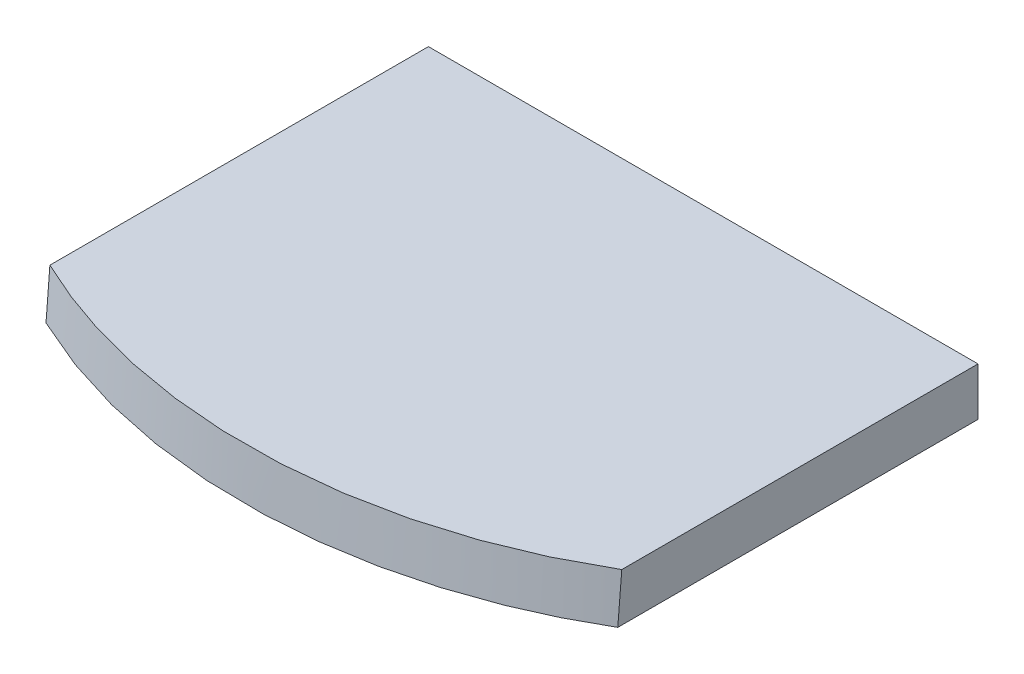
ISO-10303-21;
HEADER;
FILE_DESCRIPTION(('STEP AP214'),'2;1');
FILE_NAME('part.step','',(''),(''),'','','');
FILE_SCHEMA(('AUTOMOTIVE_DESIGN { 1 0 10303 214 1 1 1 1 }'));
ENDSEC;
DATA;
#1=APPLICATION_CONTEXT('core data for automotive mechanical design processes');
#2=APPLICATION_PROTOCOL_DEFINITION('international standard','automotive_design',2000,#1);
#3=PRODUCT_CONTEXT('',#1,'mechanical');
#4=PRODUCT('Part','Part','',(#3));
#5=PRODUCT_RELATED_PRODUCT_CATEGORY('part','',(#4));
#6=PRODUCT_DEFINITION_FORMATION('','',#4);
#7=PRODUCT_DEFINITION_CONTEXT('part definition',#1,'design');
#8=PRODUCT_DEFINITION('design','',#6,#7);
#9=PRODUCT_DEFINITION_SHAPE('','',#8);
#10=(LENGTH_UNIT() NAMED_UNIT(*) SI_UNIT(.MILLI.,.METRE.));
#11=(NAMED_UNIT(*) PLANE_ANGLE_UNIT() SI_UNIT($,.RADIAN.));
#12=(NAMED_UNIT(*) SI_UNIT($,.STERADIAN.) SOLID_ANGLE_UNIT());
#13=UNCERTAINTY_MEASURE_WITH_UNIT(LENGTH_MEASURE(1.E-05),#10,'distance_accuracy_value','');
#14=(GEOMETRIC_REPRESENTATION_CONTEXT(3) GLOBAL_UNCERTAINTY_ASSIGNED_CONTEXT((#13)) GLOBAL_UNIT_ASSIGNED_CONTEXT((#10,
#11,#12)) REPRESENTATION_CONTEXT('',''));
#15=CARTESIAN_POINT('',(0.,0.,0.));
#16=DIRECTION('',(0.,0.,1.));
#17=DIRECTION('',(1.,0.,0.));
#18=AXIS2_PLACEMENT_3D('',#15,#16,#17);
#19=CARTESIAN_POINT('',(21.5,-176.5,20.8978327647945));
#20=DIRECTION('',(-1.,0.,0.));
#21=DIRECTION('',(0.,-1.,0.));
#22=AXIS2_PLACEMENT_3D('',#19,#20,#21);
#23=PLANE('',#22);
#24=CARTESIAN_POINT('',(21.5,-186.5,25.9269520773484));
#25=CARTESIAN_POINT('',(21.5,-187.083331798923,25.975530300075));
#26=CARTESIAN_POINT('',(21.5,-187.666664365051,26.0240993066086));
#27=CARTESIAN_POINT('',(21.5000000000001,-188.833331031718,26.1212188872896));
#28=CARTESIAN_POINT('',(21.5000000000001,-189.416665132256,26.169769461437));
#29=CARTESIAN_POINT('',(21.5000000000001,-190.,26.2183108193915));
#30=B_SPLINE_CURVE_WITH_KNOTS('',3,(#24,#25,#26,#27,#28,#29),.UNSPECIFIED.,.F.,.F.,(4,2,4),(0.,
1.75605309712185,3.51210619424374),.UNSPECIFIED.);
#31=CARTESIAN_POINT('',(21.5,-186.5,25.9269520773484));
#32=VERTEX_POINT('',#31);
#33=CARTESIAN_POINT('',(21.499999810714,-190.,26.2183113624354));
#34=VERTEX_POINT('',#33);
#35=EDGE_CURVE('E170',#32,#34,#30,.T.);
#36=ORIENTED_EDGE('',*,*,#35,.T.);
#37=DIRECTION('',(0.,0.,1.));
#38=VECTOR('',#37,1.);
#39=CARTESIAN_POINT('',(21.5000000000001,-190.,0.));
#40=LINE('',#39,#38);
#41=CARTESIAN_POINT('',(21.5,-190.,0.));
#42=VERTEX_POINT('',#41);
#43=EDGE_CURVE('E70',#42,#34,#40,.T.);
#44=ORIENTED_EDGE('',*,*,#43,.F.);
#45=DIRECTION('',(0.,-1.,0.));
#46=VECTOR('',#45,1.);
#47=CARTESIAN_POINT('',(21.4999999999996,0.,0.));
#48=LINE('',#47,#46);
#49=CARTESIAN_POINT('',(21.5000000005769,-186.5,0.));
#50=VERTEX_POINT('',#49);
#51=EDGE_CURVE('E48',#50,#42,#48,.T.);
#52=ORIENTED_EDGE('',*,*,#51,.F.);
#53=DIRECTION('',(0.,0.,-1.));
#54=VECTOR('',#53,1.);
#55=CARTESIAN_POINT('',(21.5,-186.5,20.8978327647945));
#56=LINE('',#55,#54);
#57=EDGE_CURVE('E11',#32,#50,#56,.T.);
#58=ORIENTED_EDGE('',*,*,#57,.F.);
#59=EDGE_LOOP('',(#36,#44,#52,#58));
#60=FACE_BOUND('',#59,.T.);
#61=ADVANCED_FACE('F43',(#60),#23,.F.);
#62=CARTESIAN_POINT('',(0.,0.,0.));
#63=DIRECTION('',(0.,0.,1.));
#64=DIRECTION('',(1.,0.,0.));
#65=AXIS2_PLACEMENT_3D('',#62,#63,#64);
#66=PLANE('',#65);
#67=DIRECTION('',(0.,-1.,0.));
#68=VECTOR('',#67,1.);
#69=CARTESIAN_POINT('',(-18.5,0.,0.));
#70=LINE('',#69,#68);
#71=CARTESIAN_POINT('',(-18.5,-186.5,0.));
#72=VERTEX_POINT('',#71);
#73=CARTESIAN_POINT('',(-18.5,-190.,0.));
#74=VERTEX_POINT('',#73);
#75=EDGE_CURVE('E52',#72,#74,#70,.T.);
#76=ORIENTED_EDGE('',*,*,#75,.F.);
#77=DIRECTION('',(1.,0.,0.));
#78=VECTOR('',#77,1.);
#79=CARTESIAN_POINT('',(0.,-186.5,0.));
#80=LINE('',#79,#78);
#81=EDGE_CURVE('E81',#72,#50,#80,.T.);
#82=ORIENTED_EDGE('',*,*,#81,.T.);
#83=ORIENTED_EDGE('',*,*,#51,.T.);
#84=DIRECTION('',(1.,0.,0.));
#85=VECTOR('',#84,1.);
#86=CARTESIAN_POINT('',(0.,-190.,0.));
#87=LINE('',#86,#85);
#88=EDGE_CURVE('E92',#74,#42,#87,.T.);
#89=ORIENTED_EDGE('',*,*,#88,.F.);
#90=EDGE_LOOP('',(#76,#82,#83,#89));
#91=FACE_BOUND('',#90,.T.);
#92=ADVANCED_FACE('F93',(#91),#66,.F.);
#93=CARTESIAN_POINT('',(-18.5,-156.5,21.131836958515));
#94=DIRECTION('',(-1.,0.,0.));
#95=DIRECTION('',(0.,0.,1.));
#96=AXIS2_PLACEMENT_3D('',#93,#94,#95);
#97=PLANE('',#96);
#98=CARTESIAN_POINT('',(-18.5,-186.5,27.5518127987688));
#99=CARTESIAN_POINT('',(-18.5,-187.666666666667,27.6461721906388));
#100=CARTESIAN_POINT('',(-18.5,-188.833333333333,27.7405315825088));
#101=CARTESIAN_POINT('',(-18.5,-190.,27.8348909743788));
#102=B_SPLINE_CURVE_WITH_KNOTS('',3,(#98,#99,#100,#101),.UNSPECIFIED.,.F.,.F.,(4,4),(0.,
3.51142894752363),.UNSPECIFIED.);
#103=CARTESIAN_POINT('',(-18.5,-186.5,27.5518127987688));
#104=VERTEX_POINT('',#103);
#105=CARTESIAN_POINT('',(-18.4999997004693,-190.,27.8348918832198));
#106=VERTEX_POINT('',#105);
#107=EDGE_CURVE('E105',#104,#106,#102,.T.);
#108=ORIENTED_EDGE('',*,*,#107,.F.);
#109=DIRECTION('',(0.,0.,1.));
#110=VECTOR('',#109,1.);
#111=CARTESIAN_POINT('',(-18.5,-186.5,0.));
#112=LINE('',#111,#110);
#113=EDGE_CURVE('E90',#72,#104,#112,.T.);
#114=ORIENTED_EDGE('',*,*,#113,.F.);
#115=ORIENTED_EDGE('',*,*,#75,.T.);
#116=DIRECTION('',(0.,0.,1.));
#117=VECTOR('',#116,1.);
#118=CARTESIAN_POINT('',(-18.5,-190.,0.));
#119=LINE('',#118,#117);
#120=EDGE_CURVE('E91',#74,#106,#119,.T.);
#121=ORIENTED_EDGE('',*,*,#120,.T.);
#122=EDGE_LOOP('',(#108,#114,#115,#121));
#123=FACE_BOUND('',#122,.T.);
#124=ADVANCED_FACE('F99',(#123),#97,.T.);
#125=CARTESIAN_POINT('',(0.086150742203567,-186.5,-28.2226236497702));
#126=DIRECTION('',(0.,1.,0.));
#127=DIRECTION('',(0.,0.,1.));
#128=AXIS2_PLACEMENT_3D('',#125,#126,#127);
#129=PLANE('',#128);
#130=CARTESIAN_POINT('',(21.5,-186.5,25.9269520773484));
#131=CARTESIAN_POINT('',(20.8629611369327,-186.5,26.3095395728034));
#132=CARTESIAN_POINT('',(20.2147372580556,-186.5,26.6733690703601));
#133=CARTESIAN_POINT('',(18.8987141476861,-186.5,27.3632466645531));
#134=CARTESIAN_POINT('',(18.2309206066079,-186.5,27.6893056100708));
#135=CARTESIAN_POINT('',(16.8781830075039,-186.5,28.3035972016351));
#136=CARTESIAN_POINT('',(16.1932389501211,-186.5,28.5918298490999));
#137=CARTESIAN_POINT('',(14.8130410579458,-186.5,29.1286870724475));
#138=CARTESIAN_POINT('',(14.1178807037038,-186.5,29.3775522832703));
#139=CARTESIAN_POINT('',(12.715301818593,-186.5,29.83784563291));
#140=CARTESIAN_POINT('',(12.0078836992002,-186.5,30.0492750257323));
#141=CARTESIAN_POINT('',(10.5831830395512,-186.5,30.4346539637769));
#142=CARTESIAN_POINT('',(9.86590342894757,-186.5,30.6086143948271));
#143=CARTESIAN_POINT('',(8.04832980039916,-186.5,30.9998812216087));
#144=CARTESIAN_POINT('',(6.94267970409935,-186.5,31.1927420744774));
#145=CARTESIAN_POINT('',(4.7186030381486,-186.5,31.4924200956508));
#146=CARTESIAN_POINT('',(3.60016288456659,-186.5,31.5991350621007));
#147=CARTESIAN_POINT('',(1.34538590842629,-186.5,31.7269756808644));
#148=CARTESIAN_POINT('',(0.208990915297379,-186.5,31.7471060243767));
#149=CARTESIAN_POINT('',(-1.4941090198449,-186.5,31.7110868954886));
#150=CARTESIAN_POINT('',(-2.06169548250758,-186.5,31.6880313376038));
#151=CARTESIAN_POINT('',(-3.19566764756735,-186.5,31.6198250925035));
#152=CARTESIAN_POINT('',(-3.76205305878072,-186.5,31.5746695523996));
#153=CARTESIAN_POINT('',(-5.45773858817607,-186.5,31.4060481853084));
#154=CARTESIAN_POINT('',(-6.5839111700946,-186.5,31.2494203967147));
#155=CARTESIAN_POINT('',(-8.82043826074094,-186.5,30.8475953443793));
#156=CARTESIAN_POINT('',(-9.93079192674177,-186.5,30.6023933801964));
#157=CARTESIAN_POINT('',(-11.6727578380532,-186.5,30.1433614693025));
#158=CARTESIAN_POINT('',(-12.3121553348011,-186.5,29.9586104607181));
#159=CARTESIAN_POINT('',(-13.5811950316221,-186.5,29.5587486436058));
#160=CARTESIAN_POINT('',(-14.2108404132699,-186.5,29.3436479783278));
#161=CARTESIAN_POINT('',(-15.457967129485,-186.5,28.8834072822224));
#162=CARTESIAN_POINT('',(-16.0754655732768,-186.5,28.6383136317168));
#163=CARTESIAN_POINT('',(-17.2977473446963,-186.5,28.1177953166953));
#164=CARTESIAN_POINT('',(-17.9025269713198,-186.5,27.8423619652804));
#165=CARTESIAN_POINT('',(-18.5,-186.5,27.5518127987688));
#166=B_SPLINE_CURVE_WITH_KNOTS('',3,(#130,#131,#132,#133,#134,#135,#136,#137,#138,#139,#140,
#141,#142,#143,#144,#145,#146,#147,#148,#149,#150,#151,#152,#153,#154,#155,#156,#157,#158,#159,
#160,#161,#162,#163,#164,#165),.UNSPECIFIED.,.F.,.F.,(4,2,2,2,2,2,2,2,2,2,2,2,2,2,2,2,2,4),(0.,
2.2288672301701,4.45709266430694,6.68531801490489,8.8993478889673,11.113303584584,
13.3266151911749,16.6899883939593,20.0573459990702,23.4633103604784,25.1671057593613,
26.8712754590371,30.2785879905327,33.6860813673563,35.6820724197108,37.6773979591168,
39.6696760738901,41.662526110147),.UNSPECIFIED.);
#167=EDGE_CURVE('E137',#32,#104,#166,.T.);
#168=ORIENTED_EDGE('',*,*,#167,.F.);
#169=ORIENTED_EDGE('',*,*,#57,.T.);
#170=ORIENTED_EDGE('',*,*,#81,.F.);
#171=ORIENTED_EDGE('',*,*,#113,.T.);
#172=EDGE_LOOP('',(#168,#169,#170,#171));
#173=FACE_BOUND('',#172,.T.);
#174=ADVANCED_FACE('F82',(#173),#129,.T.);
#175=CARTESIAN_POINT('',(-0.0942476803876341,-190.,31.9998989353041));
#176=CARTESIAN_POINT('',(0.,0.,17.5));
#177=CARTESIAN_POINT('',(0.000942476803874733,1.9,17.355001010647));
#178=CARTESIAN_POINT('',(74.9055154492315,-190.,32.1607483098324));
#179=CARTESIAN_POINT('',(52.,0.,17.5));
#180=CARTESIAN_POINT('',(51.7709448455077,1.9,17.3533925169017));
#181=CARTESIAN_POINT('',(75.0940108100067,-190.,-31.839049560776));
#182=CARTESIAN_POINT('',(52.,0.,-17.5));
#183=CARTESIAN_POINT('',(51.7690598918999,1.9,-17.3566095043922));
#184=CARTESIAN_POINT('',(0.0942476803875962,-190.,-31.9998989353041));
#185=CARTESIAN_POINT('',(0.,0.,-17.5));
#186=CARTESIAN_POINT('',(-0.000942476803871138,1.9,-17.355001010647));
#187=CARTESIAN_POINT('',(-74.9055154492314,-190.,-32.1607483098323));
#188=CARTESIAN_POINT('',(-52.,0.,-17.5));
#189=CARTESIAN_POINT('',(-51.7709448455077,1.9,-17.3533925169017));
#190=CARTESIAN_POINT('',(-75.0940108100066,-190.,31.839049560776));
#191=CARTESIAN_POINT('',(-52.,0.,17.5));
#192=CARTESIAN_POINT('',(-51.7690598918999,1.9,17.3566095043922));
#193=CARTESIAN_POINT('',(-0.0942476803876341,-190.,31.9998989353041));
#194=CARTESIAN_POINT('',(0.,0.,17.5));
#195=CARTESIAN_POINT('',(0.000942476803874733,1.9,17.355001010647));
#196=(BOUNDED_SURFACE() B_SPLINE_SURFACE(3,1,((#175,#176,#177),(#178,#179,#180),(#181,#182,
#183),(#184,#185,#186),(#187,#188,#189),(#190,#191,#192),(#193,#194,#195)),.UNSPECIFIED.,.T.,
.F.,.F.) B_SPLINE_SURFACE_WITH_KNOTS((4,3,4),(2,1,2),(0.,0.5,1.),(0.,1.,1.01),
.UNSPECIFIED.) GEOMETRIC_REPRESENTATION_ITEM() RATIONAL_B_SPLINE_SURFACE(((1.,1.,1.),
(0.333333333333333,0.333333333333333,0.333333333333333),(0.333333333333333,0.333333333333333,
0.333333333333333),(1.,1.,1.),(0.333333333333333,0.333333333333333,0.333333333333333),
(0.333333333333333,0.333333333333333,0.333333333333333),(1.,1.,1.))) REPRESENTATION_ITEM('') SURFACE());
#197=CARTESIAN_POINT('',(0.,-190.,0.));
#198=DIRECTION('',(0.,1.,0.));
#199=DIRECTION('',(1.,0.,0.));
#200=AXIS2_PLACEMENT_3D('',#197,#198,#199);
#201=ELLIPSE('',#200,37.5,32.);
#202=EDGE_CURVE('E97',#106,#34,#201,.T.);
#203=CARTESIAN_POINT('',(0.0942476803875962,-190.,-31.9998989353041));
#204=CARTESIAN_POINT('',(0.,0.,-17.5));
#205=CARTESIAN_POINT('',(-0.000942476803871138,1.9,-17.355001010647));
#206=CARTESIAN_POINT('',(-74.9055154492314,-190.,-32.1607483098323));
#207=CARTESIAN_POINT('',(-52.,0.,-17.5));
#208=CARTESIAN_POINT('',(-51.7709448455077,1.9,-17.3533925169017));
#209=CARTESIAN_POINT('',(-75.0940108100066,-190.,31.839049560776));
#210=CARTESIAN_POINT('',(-52.,0.,17.5));
#211=CARTESIAN_POINT('',(-51.7690598918999,1.9,17.3566095043922));
#212=CARTESIAN_POINT('',(-0.0942476803876341,-190.,31.9998989353041));
#213=CARTESIAN_POINT('',(0.,0.,17.5));
#214=CARTESIAN_POINT('',(0.000942476803874733,1.9,17.355001010647));
#215=CARTESIAN_POINT('',(74.9055154492315,-190.,32.1607483098324));
#216=CARTESIAN_POINT('',(52.,0.,17.5));
#217=CARTESIAN_POINT('',(51.7709448455077,1.9,17.3533925169017));
#218=CARTESIAN_POINT('',(75.0940108100067,-190.,-31.839049560776));
#219=CARTESIAN_POINT('',(52.,0.,-17.5));
#220=CARTESIAN_POINT('',(51.7690598918999,1.9,-17.3566095043922));
#221=CARTESIAN_POINT('',(0.0942476803875962,-190.,-31.9998989353041));
#222=CARTESIAN_POINT('',(0.,0.,-17.5));
#223=CARTESIAN_POINT('',(-0.000942476803871138,1.9,-17.355001010647));
#224=(BOUNDED_SURFACE() B_SPLINE_SURFACE(3,1,((#203,#204,#205),(#206,#207,#208),(#209,#210,
#211),(#212,#213,#214),(#215,#216,#217),(#218,#219,#220),(#221,#222,#223)),.UNSPECIFIED.,.T.,
.F.,.F.) B_SPLINE_SURFACE_WITH_KNOTS((4,3,4),(2,1,2),(0.5,1.,1.5),(0.,1.,1.01),
.UNSPECIFIED.) GEOMETRIC_REPRESENTATION_ITEM() RATIONAL_B_SPLINE_SURFACE(((1.,1.,1.),
(0.333333333333333,0.333333333333333,0.333333333333333),(0.333333333333333,0.333333333333333,
0.333333333333333),(1.,1.,1.),(0.333333333333333,0.333333333333333,0.333333333333333),
(0.333333333333333,0.333333333333333,0.333333333333333),(1.,1.,1.))) REPRESENTATION_ITEM('') SURFACE());
#225=ORIENTED_EDGE('',*,*,#167,.T.);
#226=ORIENTED_EDGE('',*,*,#107,.T.);
#227=ORIENTED_EDGE('',*,*,#202,.T.);
#228=ORIENTED_EDGE('',*,*,#35,.F.);
#229=EDGE_LOOP('',(#225,#226,#227,#228));
#230=FACE_BOUND('',#229,.T.);
#231=ADVANCED_FACE('F119',(#230),#224,.T.);
#232=CARTESIAN_POINT('',(0.,-190.,0.));
#233=DIRECTION('',(0.,1.,0.));
#234=DIRECTION('',(0.,0.,1.));
#235=AXIS2_PLACEMENT_3D('',#232,#233,#234);
#236=PLANE('',#235);
#237=ORIENTED_EDGE('',*,*,#88,.T.);
#238=ORIENTED_EDGE('',*,*,#43,.T.);
#239=ORIENTED_EDGE('',*,*,#202,.F.);
#240=ORIENTED_EDGE('',*,*,#120,.F.);
#241=EDGE_LOOP('',(#237,#238,#239,#240));
#242=FACE_BOUND('',#241,.T.);
#243=ADVANCED_FACE('F44',(#242),#236,.F.);
#244=CLOSED_SHELL('',(#61,#92,#124,#174,#231,#243));
#245=MANIFOLD_SOLID_BREP('B2',#244);
#246=ADVANCED_BREP_SHAPE_REPRESENTATION('',(#18,#245),#14);
#247=SHAPE_DEFINITION_REPRESENTATION(#9,#246);
ENDSEC;
END-ISO-10303-21;
